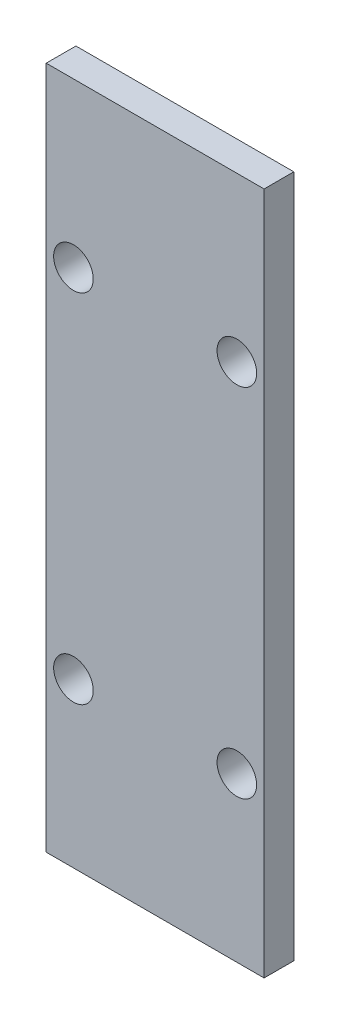
ISO-10303-21;
HEADER;
FILE_DESCRIPTION(('STEP AP214'),'2;1');
FILE_NAME('part.step','',(''),(''),'','','');
FILE_SCHEMA(('AUTOMOTIVE_DESIGN { 1 0 10303 214 1 1 1 1 }'));
ENDSEC;
DATA;
#1=APPLICATION_CONTEXT('core data for automotive mechanical design processes');
#2=APPLICATION_PROTOCOL_DEFINITION('international standard','automotive_design',2000,#1);
#3=PRODUCT_CONTEXT('',#1,'mechanical');
#4=PRODUCT('Part','Part','',(#3));
#5=PRODUCT_RELATED_PRODUCT_CATEGORY('part','',(#4));
#6=PRODUCT_DEFINITION_FORMATION('','',#4);
#7=PRODUCT_DEFINITION_CONTEXT('part definition',#1,'design');
#8=PRODUCT_DEFINITION('design','',#6,#7);
#9=PRODUCT_DEFINITION_SHAPE('','',#8);
#10=(LENGTH_UNIT() NAMED_UNIT(*) SI_UNIT(.MILLI.,.METRE.));
#11=(NAMED_UNIT(*) PLANE_ANGLE_UNIT() SI_UNIT($,.RADIAN.));
#12=(NAMED_UNIT(*) SI_UNIT($,.STERADIAN.) SOLID_ANGLE_UNIT());
#13=UNCERTAINTY_MEASURE_WITH_UNIT(LENGTH_MEASURE(1.E-05),#10,'distance_accuracy_value','');
#14=(GEOMETRIC_REPRESENTATION_CONTEXT(3) GLOBAL_UNCERTAINTY_ASSIGNED_CONTEXT((#13)) GLOBAL_UNIT_ASSIGNED_CONTEXT((#10,
#11,#12)) REPRESENTATION_CONTEXT('',''));
#15=CARTESIAN_POINT('',(0.,0.,0.));
#16=DIRECTION('',(0.,0.,1.));
#17=DIRECTION('',(1.,0.,0.));
#18=AXIS2_PLACEMENT_3D('',#15,#16,#17);
#19=CARTESIAN_POINT('',(11.,34.5,3.));
#20=DIRECTION('',(-1.,0.,0.));
#21=DIRECTION('',(0.,-1.,0.));
#22=AXIS2_PLACEMENT_3D('',#19,#20,#21);
#23=PLANE('',#22);
#24=DIRECTION('',(0.,1.,0.));
#25=VECTOR('',#24,1.);
#26=CARTESIAN_POINT('',(11.,34.5,0.));
#27=LINE('',#26,#25);
#28=CARTESIAN_POINT('',(11.,-34.5,0.));
#29=VERTEX_POINT('',#28);
#30=CARTESIAN_POINT('',(11.,34.5,0.));
#31=VERTEX_POINT('',#30);
#32=EDGE_CURVE('E108',#29,#31,#27,.T.);
#33=ORIENTED_EDGE('',*,*,#32,.T.);
#34=DIRECTION('',(0.,0.,-1.));
#35=VECTOR('',#34,1.);
#36=CARTESIAN_POINT('',(11.,34.5,3.));
#37=LINE('',#36,#35);
#38=CARTESIAN_POINT('',(11.,34.5,3.));
#39=VERTEX_POINT('',#38);
#40=EDGE_CURVE('E11',#39,#31,#37,.T.);
#41=ORIENTED_EDGE('',*,*,#40,.F.);
#42=DIRECTION('',(0.,1.,0.));
#43=VECTOR('',#42,1.);
#44=CARTESIAN_POINT('',(11.,34.5,3.));
#45=LINE('',#44,#43);
#46=CARTESIAN_POINT('',(11.,-34.5,3.));
#47=VERTEX_POINT('',#46);
#48=EDGE_CURVE('E90',#47,#39,#45,.T.);
#49=ORIENTED_EDGE('',*,*,#48,.F.);
#50=DIRECTION('',(0.,0.,-1.));
#51=VECTOR('',#50,1.);
#52=CARTESIAN_POINT('',(11.,-34.5,3.));
#53=LINE('',#52,#51);
#54=EDGE_CURVE('E104',#47,#29,#53,.T.);
#55=ORIENTED_EDGE('',*,*,#54,.T.);
#56=EDGE_LOOP('',(#33,#41,#49,#55));
#57=FACE_BOUND('',#56,.T.);
#58=ADVANCED_FACE('F38',(#57),#23,.F.);
#59=CARTESIAN_POINT('',(-11.,34.5,3.));
#60=DIRECTION('',(0.,-1.,0.));
#61=DIRECTION('',(0.,0.,-1.));
#62=AXIS2_PLACEMENT_3D('',#59,#60,#61);
#63=PLANE('',#62);
#64=DIRECTION('',(-1.,0.,0.));
#65=VECTOR('',#64,1.);
#66=CARTESIAN_POINT('',(-11.,34.5,0.));
#67=LINE('',#66,#65);
#68=CARTESIAN_POINT('',(-11.,34.5,0.));
#69=VERTEX_POINT('',#68);
#70=EDGE_CURVE('E95',#31,#69,#67,.T.);
#71=ORIENTED_EDGE('',*,*,#70,.T.);
#72=DIRECTION('',(0.,0.,-1.));
#73=VECTOR('',#72,1.);
#74=CARTESIAN_POINT('',(-11.,34.5,3.));
#75=LINE('',#74,#73);
#76=CARTESIAN_POINT('',(-11.,34.5,3.));
#77=VERTEX_POINT('',#76);
#78=EDGE_CURVE('E47',#77,#69,#75,.T.);
#79=ORIENTED_EDGE('',*,*,#78,.F.);
#80=DIRECTION('',(-1.,0.,0.));
#81=VECTOR('',#80,1.);
#82=CARTESIAN_POINT('',(-11.,34.5,3.));
#83=LINE('',#82,#81);
#84=EDGE_CURVE('E85',#39,#77,#83,.T.);
#85=ORIENTED_EDGE('',*,*,#84,.F.);
#86=ORIENTED_EDGE('',*,*,#40,.T.);
#87=EDGE_LOOP('',(#71,#79,#85,#86));
#88=FACE_BOUND('',#87,.T.);
#89=ADVANCED_FACE('F94',(#88),#63,.F.);
#90=CARTESIAN_POINT('',(-11.,34.5,3.));
#91=DIRECTION('',(1.,0.,0.));
#92=DIRECTION('',(0.,1.,0.));
#93=AXIS2_PLACEMENT_3D('',#90,#91,#92);
#94=PLANE('',#93);
#95=DIRECTION('',(0.,-1.,0.));
#96=VECTOR('',#95,1.);
#97=CARTESIAN_POINT('',(-11.,34.5,0.));
#98=LINE('',#97,#96);
#99=CARTESIAN_POINT('',(-11.,-34.5,0.));
#100=VERTEX_POINT('',#99);
#101=EDGE_CURVE('E72',#69,#100,#98,.T.);
#102=ORIENTED_EDGE('',*,*,#101,.T.);
#103=DIRECTION('',(0.,0.,-1.));
#104=VECTOR('',#103,1.);
#105=CARTESIAN_POINT('',(-11.,-34.5,3.));
#106=LINE('',#105,#104);
#107=CARTESIAN_POINT('',(-11.,-34.5,3.));
#108=VERTEX_POINT('',#107);
#109=EDGE_CURVE('E97',#108,#100,#106,.T.);
#110=ORIENTED_EDGE('',*,*,#109,.F.);
#111=DIRECTION('',(0.,-1.,0.));
#112=VECTOR('',#111,1.);
#113=CARTESIAN_POINT('',(-11.,34.5,3.));
#114=LINE('',#113,#112);
#115=EDGE_CURVE('E88',#77,#108,#114,.T.);
#116=ORIENTED_EDGE('',*,*,#115,.F.);
#117=ORIENTED_EDGE('',*,*,#78,.T.);
#118=EDGE_LOOP('',(#102,#110,#116,#117));
#119=FACE_BOUND('',#118,.T.);
#120=ADVANCED_FACE('F98',(#119),#94,.F.);
#121=CARTESIAN_POINT('',(-11.,-34.5,3.));
#122=DIRECTION('',(0.,1.,0.));
#123=DIRECTION('',(0.,0.,1.));
#124=AXIS2_PLACEMENT_3D('',#121,#122,#123);
#125=PLANE('',#124);
#126=DIRECTION('',(1.,0.,0.));
#127=VECTOR('',#126,1.);
#128=CARTESIAN_POINT('',(-11.,-34.5,0.));
#129=LINE('',#128,#127);
#130=EDGE_CURVE('E78',#100,#29,#129,.T.);
#131=ORIENTED_EDGE('',*,*,#130,.T.);
#132=ORIENTED_EDGE('',*,*,#54,.F.);
#133=DIRECTION('',(1.,0.,0.));
#134=VECTOR('',#133,1.);
#135=CARTESIAN_POINT('',(-11.,-34.5,3.));
#136=LINE('',#135,#134);
#137=EDGE_CURVE('E55',#108,#47,#136,.T.);
#138=ORIENTED_EDGE('',*,*,#137,.F.);
#139=ORIENTED_EDGE('',*,*,#109,.T.);
#140=EDGE_LOOP('',(#131,#132,#138,#139));
#141=FACE_BOUND('',#140,.T.);
#142=ADVANCED_FACE('F121',(#141),#125,.F.);
#143=CARTESIAN_POINT('',(0.,0.,3.));
#144=DIRECTION('',(0.,0.,1.));
#145=DIRECTION('',(1.,0.,0.));
#146=AXIS2_PLACEMENT_3D('',#143,#144,#145);
#147=PLANE('',#146);
#148=CARTESIAN_POINT('',(-8.25,-18.,3.));
#149=DIRECTION('',(0.,0.,1.));
#150=DIRECTION('',(1.,0.,0.));
#151=AXIS2_PLACEMENT_3D('',#148,#149,#150);
#152=CIRCLE('',#151,2.);
#153=CARTESIAN_POINT('',(-6.25,-18.,3.));
#154=VERTEX_POINT('',#153);
#155=EDGE_CURVE('E136',#154,#154,#152,.T.);
#156=ORIENTED_EDGE('',*,*,#155,.F.);
#157=EDGE_LOOP('',(#156));
#158=FACE_BOUND('',#157,.T.);
#159=CARTESIAN_POINT('',(8.25,-18.,3.));
#160=DIRECTION('',(0.,0.,1.));
#161=DIRECTION('',(1.,0.,0.));
#162=AXIS2_PLACEMENT_3D('',#159,#160,#161);
#163=CIRCLE('',#162,2.);
#164=CARTESIAN_POINT('',(10.25,-18.,3.));
#165=VERTEX_POINT('',#164);
#166=EDGE_CURVE('E143',#165,#165,#163,.T.);
#167=ORIENTED_EDGE('',*,*,#166,.F.);
#168=EDGE_LOOP('',(#167));
#169=FACE_BOUND('',#168,.T.);
#170=CARTESIAN_POINT('',(8.25,18.,3.));
#171=DIRECTION('',(0.,0.,1.));
#172=DIRECTION('',(1.,0.,0.));
#173=AXIS2_PLACEMENT_3D('',#170,#171,#172);
#174=CIRCLE('',#173,2.);
#175=CARTESIAN_POINT('',(10.25,18.,3.));
#176=VERTEX_POINT('',#175);
#177=EDGE_CURVE('E151',#176,#176,#174,.T.);
#178=ORIENTED_EDGE('',*,*,#177,.F.);
#179=EDGE_LOOP('',(#178));
#180=FACE_BOUND('',#179,.T.);
#181=CARTESIAN_POINT('',(-8.25,18.,3.));
#182=DIRECTION('',(0.,0.,1.));
#183=DIRECTION('',(1.,0.,0.));
#184=AXIS2_PLACEMENT_3D('',#181,#182,#183);
#185=CIRCLE('',#184,2.);
#186=CARTESIAN_POINT('',(-6.25,18.,3.));
#187=VERTEX_POINT('',#186);
#188=EDGE_CURVE('E128',#187,#187,#185,.T.);
#189=ORIENTED_EDGE('',*,*,#188,.F.);
#190=EDGE_LOOP('',(#189));
#191=FACE_BOUND('',#190,.T.);
#192=ORIENTED_EDGE('',*,*,#48,.T.);
#193=ORIENTED_EDGE('',*,*,#84,.T.);
#194=ORIENTED_EDGE('',*,*,#115,.T.);
#195=ORIENTED_EDGE('',*,*,#137,.T.);
#196=EDGE_LOOP('',(#192,#193,#194,#195));
#197=FACE_BOUND('',#196,.T.);
#198=ADVANCED_FACE('F86',(#158,#169,#180,#191,#197),#147,.T.);
#199=CARTESIAN_POINT('',(0.,0.,0.));
#200=DIRECTION('',(0.,0.,1.));
#201=DIRECTION('',(1.,0.,0.));
#202=AXIS2_PLACEMENT_3D('',#199,#200,#201);
#203=PLANE('',#202);
#204=CARTESIAN_POINT('',(-8.25,-18.,0.));
#205=DIRECTION('',(0.,0.,1.));
#206=DIRECTION('',(1.,0.,0.));
#207=AXIS2_PLACEMENT_3D('',#204,#205,#206);
#208=CIRCLE('',#207,2.);
#209=CARTESIAN_POINT('',(-6.25,-18.,0.));
#210=VERTEX_POINT('',#209);
#211=EDGE_CURVE('E139',#210,#210,#208,.T.);
#212=ORIENTED_EDGE('',*,*,#211,.T.);
#213=EDGE_LOOP('',(#212));
#214=FACE_BOUND('',#213,.T.);
#215=CARTESIAN_POINT('',(8.25,-18.,0.));
#216=DIRECTION('',(0.,0.,1.));
#217=DIRECTION('',(1.,0.,0.));
#218=AXIS2_PLACEMENT_3D('',#215,#216,#217);
#219=CIRCLE('',#218,2.);
#220=CARTESIAN_POINT('',(10.25,-18.,0.));
#221=VERTEX_POINT('',#220);
#222=EDGE_CURVE('E147',#221,#221,#219,.T.);
#223=ORIENTED_EDGE('',*,*,#222,.T.);
#224=EDGE_LOOP('',(#223));
#225=FACE_BOUND('',#224,.T.);
#226=CARTESIAN_POINT('',(8.25,18.,0.));
#227=DIRECTION('',(0.,0.,1.));
#228=DIRECTION('',(1.,0.,0.));
#229=AXIS2_PLACEMENT_3D('',#226,#227,#228);
#230=CIRCLE('',#229,2.);
#231=CARTESIAN_POINT('',(10.25,18.,0.));
#232=VERTEX_POINT('',#231);
#233=EDGE_CURVE('E132',#232,#232,#230,.T.);
#234=ORIENTED_EDGE('',*,*,#233,.T.);
#235=EDGE_LOOP('',(#234));
#236=FACE_BOUND('',#235,.T.);
#237=CARTESIAN_POINT('',(-8.25,18.,0.));
#238=DIRECTION('',(0.,0.,1.));
#239=DIRECTION('',(1.,0.,0.));
#240=AXIS2_PLACEMENT_3D('',#237,#238,#239);
#241=CIRCLE('',#240,2.);
#242=CARTESIAN_POINT('',(-6.25,18.,0.));
#243=VERTEX_POINT('',#242);
#244=EDGE_CURVE('E111',#243,#243,#241,.T.);
#245=ORIENTED_EDGE('',*,*,#244,.T.);
#246=EDGE_LOOP('',(#245));
#247=FACE_BOUND('',#246,.T.);
#248=ORIENTED_EDGE('',*,*,#32,.F.);
#249=ORIENTED_EDGE('',*,*,#130,.F.);
#250=ORIENTED_EDGE('',*,*,#101,.F.);
#251=ORIENTED_EDGE('',*,*,#70,.F.);
#252=EDGE_LOOP('',(#248,#249,#250,#251));
#253=FACE_BOUND('',#252,.T.);
#254=ADVANCED_FACE('F124',(#214,#225,#236,#247,#253),#203,.F.);
#255=CARTESIAN_POINT('',(-8.25,18.,0.));
#256=DIRECTION('',(0.,0.,1.));
#257=DIRECTION('',(1.,0.,0.));
#258=AXIS2_PLACEMENT_3D('',#255,#256,#257);
#259=CYLINDRICAL_SURFACE('',#258,2.);
#260=ORIENTED_EDGE('',*,*,#244,.F.);
#261=EDGE_LOOP('',(#260));
#262=FACE_BOUND('',#261,.T.);
#263=ORIENTED_EDGE('',*,*,#188,.T.);
#264=EDGE_LOOP('',(#263));
#265=FACE_BOUND('',#264,.T.);
#266=ADVANCED_FACE('F165',(#262,#265),#259,.F.);
#267=CARTESIAN_POINT('',(8.25,18.,0.));
#268=DIRECTION('',(0.,0.,1.));
#269=DIRECTION('',(1.,0.,0.));
#270=AXIS2_PLACEMENT_3D('',#267,#268,#269);
#271=CYLINDRICAL_SURFACE('',#270,2.);
#272=ORIENTED_EDGE('',*,*,#233,.F.);
#273=EDGE_LOOP('',(#272));
#274=FACE_BOUND('',#273,.T.);
#275=ORIENTED_EDGE('',*,*,#177,.T.);
#276=EDGE_LOOP('',(#275));
#277=FACE_BOUND('',#276,.T.);
#278=ADVANCED_FACE('F161',(#274,#277),#271,.F.);
#279=CARTESIAN_POINT('',(8.25,-18.,0.));
#280=DIRECTION('',(0.,0.,1.));
#281=DIRECTION('',(1.,0.,0.));
#282=AXIS2_PLACEMENT_3D('',#279,#280,#281);
#283=CYLINDRICAL_SURFACE('',#282,2.);
#284=ORIENTED_EDGE('',*,*,#222,.F.);
#285=EDGE_LOOP('',(#284));
#286=FACE_BOUND('',#285,.T.);
#287=ORIENTED_EDGE('',*,*,#166,.T.);
#288=EDGE_LOOP('',(#287));
#289=FACE_BOUND('',#288,.T.);
#290=ADVANCED_FACE('F164',(#286,#289),#283,.F.);
#291=CARTESIAN_POINT('',(-8.25,-18.,0.));
#292=DIRECTION('',(0.,0.,1.));
#293=DIRECTION('',(1.,0.,0.));
#294=AXIS2_PLACEMENT_3D('',#291,#292,#293);
#295=CYLINDRICAL_SURFACE('',#294,2.);
#296=ORIENTED_EDGE('',*,*,#211,.F.);
#297=EDGE_LOOP('',(#296));
#298=FACE_BOUND('',#297,.T.);
#299=ORIENTED_EDGE('',*,*,#155,.T.);
#300=EDGE_LOOP('',(#299));
#301=FACE_BOUND('',#300,.T.);
#302=ADVANCED_FACE('F220',(#298,#301),#295,.F.);
#303=CLOSED_SHELL('',(#58,#89,#120,#142,#198,#254,#266,#278,#290,#302));
#304=MANIFOLD_SOLID_BREP('B2',#303);
#305=ADVANCED_BREP_SHAPE_REPRESENTATION('',(#18,#304),#14);
#306=SHAPE_DEFINITION_REPRESENTATION(#9,#305);
ENDSEC;
END-ISO-10303-21;
